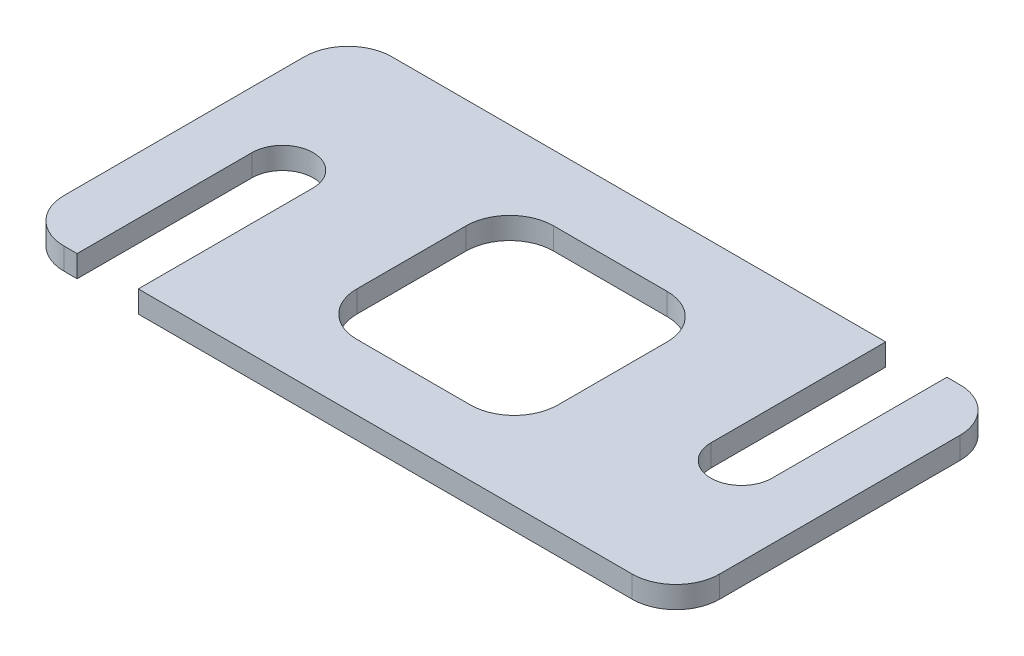
ISO-10303-21;
HEADER;
FILE_DESCRIPTION(('STEP AP214'),'2;1');
FILE_NAME('part.step','',(''),(''),'','','');
FILE_SCHEMA(('AUTOMOTIVE_DESIGN { 1 0 10303 214 1 1 1 1 }'));
ENDSEC;
DATA;
#1=APPLICATION_CONTEXT('core data for automotive mechanical design processes');
#2=APPLICATION_PROTOCOL_DEFINITION('international standard','automotive_design',2000,#1);
#3=PRODUCT_CONTEXT('',#1,'mechanical');
#4=PRODUCT('Part','Part','',(#3));
#5=PRODUCT_RELATED_PRODUCT_CATEGORY('part','',(#4));
#6=PRODUCT_DEFINITION_FORMATION('','',#4);
#7=PRODUCT_DEFINITION_CONTEXT('part definition',#1,'design');
#8=PRODUCT_DEFINITION('design','',#6,#7);
#9=PRODUCT_DEFINITION_SHAPE('','',#8);
#10=(LENGTH_UNIT() NAMED_UNIT(*) SI_UNIT(.MILLI.,.METRE.));
#11=(NAMED_UNIT(*) PLANE_ANGLE_UNIT() SI_UNIT($,.RADIAN.));
#12=(NAMED_UNIT(*) SI_UNIT($,.STERADIAN.) SOLID_ANGLE_UNIT());
#13=UNCERTAINTY_MEASURE_WITH_UNIT(LENGTH_MEASURE(1.E-05),#10,'distance_accuracy_value','');
#14=(GEOMETRIC_REPRESENTATION_CONTEXT(3) GLOBAL_UNCERTAINTY_ASSIGNED_CONTEXT((#13)) GLOBAL_UNIT_ASSIGNED_CONTEXT((#10,
#11,#12)) REPRESENTATION_CONTEXT('',''));
#15=CARTESIAN_POINT('',(0.,0.,0.));
#16=DIRECTION('',(0.,0.,1.));
#17=DIRECTION('',(1.,0.,0.));
#18=AXIS2_PLACEMENT_3D('',#15,#16,#17);
#19=CARTESIAN_POINT('',(150.,5.,0.));
#20=DIRECTION('',(0.,0.,-1.));
#21=DIRECTION('',(-1.,0.,0.));
#22=AXIS2_PLACEMENT_3D('',#19,#20,#21);
#23=PLANE('',#22);
#24=DIRECTION('',(1.,0.,0.));
#25=VECTOR('',#24,1.);
#26=CARTESIAN_POINT('',(150.,5.,0.));
#27=LINE('',#26,#25);
#28=CARTESIAN_POINT('',(10.,5.,0.));
#29=VERTEX_POINT('',#28);
#30=CARTESIAN_POINT('',(13.,5.,0.));
#31=VERTEX_POINT('',#30);
#32=EDGE_CURVE('E390',#29,#31,#27,.T.);
#33=ORIENTED_EDGE('',*,*,#32,.F.);
#34=DIRECTION('',(0.,-1.,0.));
#35=VECTOR('',#34,1.);
#36=CARTESIAN_POINT('',(10.,5.,0.));
#37=LINE('',#36,#35);
#38=CARTESIAN_POINT('',(10.,0.,0.));
#39=VERTEX_POINT('',#38);
#40=EDGE_CURVE('E281',#29,#39,#37,.T.);
#41=ORIENTED_EDGE('',*,*,#40,.T.);
#42=DIRECTION('',(1.,0.,0.));
#43=VECTOR('',#42,1.);
#44=CARTESIAN_POINT('',(150.,0.,0.));
#45=LINE('',#44,#43);
#46=CARTESIAN_POINT('',(13.,0.,0.));
#47=VERTEX_POINT('',#46);
#48=EDGE_CURVE('E229',#39,#47,#45,.T.);
#49=ORIENTED_EDGE('',*,*,#48,.T.);
#50=DIRECTION('',(0.,1.,0.));
#51=VECTOR('',#50,1.);
#52=CARTESIAN_POINT('',(13.,0.,0.));
#53=LINE('',#52,#51);
#54=EDGE_CURVE('E362',#47,#31,#53,.T.);
#55=ORIENTED_EDGE('',*,*,#54,.T.);
#56=EDGE_LOOP('',(#33,#41,#49,#55));
#57=FACE_BOUND('',#56,.T.);
#58=ADVANCED_FACE('F41',(#57),#23,.F.);
#59=CARTESIAN_POINT('',(0.,5.,-75.));
#60=DIRECTION('',(0.,0.,1.));
#61=DIRECTION('',(1.,0.,0.));
#62=AXIS2_PLACEMENT_3D('',#59,#60,#61);
#63=PLANE('',#62);
#64=DIRECTION('',(-1.,0.,0.));
#65=VECTOR('',#64,1.);
#66=CARTESIAN_POINT('',(0.,5.,-75.));
#67=LINE('',#66,#65);
#68=CARTESIAN_POINT('',(140.,5.,-75.));
#69=VERTEX_POINT('',#68);
#70=CARTESIAN_POINT('',(137.,5.,-75.));
#71=VERTEX_POINT('',#70);
#72=EDGE_CURVE('E395',#69,#71,#67,.T.);
#73=ORIENTED_EDGE('',*,*,#72,.F.);
#74=DIRECTION('',(0.,-1.,0.));
#75=VECTOR('',#74,1.);
#76=CARTESIAN_POINT('',(140.,5.,-75.));
#77=LINE('',#76,#75);
#78=CARTESIAN_POINT('',(140.,0.,-75.));
#79=VERTEX_POINT('',#78);
#80=EDGE_CURVE('E278',#69,#79,#77,.T.);
#81=ORIENTED_EDGE('',*,*,#80,.T.);
#82=DIRECTION('',(-1.,0.,0.));
#83=VECTOR('',#82,1.);
#84=CARTESIAN_POINT('',(0.,0.,-75.));
#85=LINE('',#84,#83);
#86=CARTESIAN_POINT('',(137.,0.,-75.));
#87=VERTEX_POINT('',#86);
#88=EDGE_CURVE('E243',#79,#87,#85,.T.);
#89=ORIENTED_EDGE('',*,*,#88,.T.);
#90=DIRECTION('',(0.,1.,0.));
#91=VECTOR('',#90,1.);
#92=CARTESIAN_POINT('',(137.,0.,-75.));
#93=LINE('',#92,#91);
#94=EDGE_CURVE('E352',#87,#71,#93,.T.);
#95=ORIENTED_EDGE('',*,*,#94,.T.);
#96=EDGE_LOOP('',(#73,#81,#89,#95));
#97=FACE_BOUND('',#96,.T.);
#98=ADVANCED_FACE('F445',(#97),#63,.F.);
#99=CARTESIAN_POINT('',(27.,0.,0.));
#100=VERTEX_POINT('',#99);
#101=CARTESIAN_POINT('',(140.,0.,0.));
#102=VERTEX_POINT('',#101);
#103=EDGE_CURVE('E220',#100,#102,#45,.T.);
#104=ORIENTED_EDGE('',*,*,#103,.T.);
#105=DIRECTION('',(0.,-1.,0.));
#106=VECTOR('',#105,1.);
#107=CARTESIAN_POINT('',(140.,5.,0.));
#108=LINE('',#107,#106);
#109=CARTESIAN_POINT('',(140.,5.,0.));
#110=VERTEX_POINT('',#109);
#111=EDGE_CURVE('E268',#102,#110,#108,.F.);
#112=ORIENTED_EDGE('',*,*,#111,.T.);
#113=CARTESIAN_POINT('',(27.,5.,0.));
#114=VERTEX_POINT('',#113);
#115=EDGE_CURVE('E223',#114,#110,#27,.T.);
#116=ORIENTED_EDGE('',*,*,#115,.F.);
#117=DIRECTION('',(0.,1.,0.));
#118=VECTOR('',#117,1.);
#119=CARTESIAN_POINT('',(27.,0.,0.));
#120=LINE('',#119,#118);
#121=EDGE_CURVE('E206',#100,#114,#120,.T.);
#122=ORIENTED_EDGE('',*,*,#121,.F.);
#123=EDGE_LOOP('',(#104,#112,#116,#122));
#124=FACE_BOUND('',#123,.T.);
#125=ADVANCED_FACE('F219',(#124),#23,.F.);
#126=CARTESIAN_POINT('',(150.,5.,-75.));
#127=DIRECTION('',(-1.,0.,0.));
#128=DIRECTION('',(0.,0.,1.));
#129=AXIS2_PLACEMENT_3D('',#126,#127,#128);
#130=PLANE('',#129);
#131=DIRECTION('',(0.,0.,-1.));
#132=VECTOR('',#131,1.);
#133=CARTESIAN_POINT('',(150.,5.,-75.));
#134=LINE('',#133,#132);
#135=CARTESIAN_POINT('',(150.,5.,-10.));
#136=VERTEX_POINT('',#135);
#137=CARTESIAN_POINT('',(150.,5.,-65.));
#138=VERTEX_POINT('',#137);
#139=EDGE_CURVE('E392',#136,#138,#134,.T.);
#140=ORIENTED_EDGE('',*,*,#139,.F.);
#141=DIRECTION('',(0.,-1.,0.));
#142=VECTOR('',#141,1.);
#143=CARTESIAN_POINT('',(150.,5.,-10.));
#144=LINE('',#143,#142);
#145=CARTESIAN_POINT('',(150.,0.,-10.));
#146=VERTEX_POINT('',#145);
#147=EDGE_CURVE('E258',#136,#146,#144,.T.);
#148=ORIENTED_EDGE('',*,*,#147,.T.);
#149=DIRECTION('',(0.,0.,-1.));
#150=VECTOR('',#149,1.);
#151=CARTESIAN_POINT('',(150.,0.,-75.));
#152=LINE('',#151,#150);
#153=CARTESIAN_POINT('',(150.,0.,-65.));
#154=VERTEX_POINT('',#153);
#155=EDGE_CURVE('E232',#146,#154,#152,.T.);
#156=ORIENTED_EDGE('',*,*,#155,.T.);
#157=DIRECTION('',(0.,-1.,0.));
#158=VECTOR('',#157,1.);
#159=CARTESIAN_POINT('',(150.,5.,-65.));
#160=LINE('',#159,#158);
#161=EDGE_CURVE('E256',#154,#138,#160,.F.);
#162=ORIENTED_EDGE('',*,*,#161,.T.);
#163=EDGE_LOOP('',(#140,#148,#156,#162));
#164=FACE_BOUND('',#163,.T.);
#165=ADVANCED_FACE('F437',(#164),#130,.F.);
#166=CARTESIAN_POINT('',(123.,0.,-75.));
#167=VERTEX_POINT('',#166);
#168=CARTESIAN_POINT('',(10.,0.,-75.));
#169=VERTEX_POINT('',#168);
#170=EDGE_CURVE('E242',#167,#169,#85,.T.);
#171=ORIENTED_EDGE('',*,*,#170,.T.);
#172=DIRECTION('',(0.,-1.,0.));
#173=VECTOR('',#172,1.);
#174=CARTESIAN_POINT('',(10.,5.,-75.));
#175=LINE('',#174,#173);
#176=CARTESIAN_POINT('',(10.,5.,-75.));
#177=VERTEX_POINT('',#176);
#178=EDGE_CURVE('E289',#169,#177,#175,.F.);
#179=ORIENTED_EDGE('',*,*,#178,.T.);
#180=CARTESIAN_POINT('',(123.,5.,-75.));
#181=VERTEX_POINT('',#180);
#182=EDGE_CURVE('E394',#181,#177,#67,.T.);
#183=ORIENTED_EDGE('',*,*,#182,.F.);
#184=DIRECTION('',(0.,1.,0.));
#185=VECTOR('',#184,1.);
#186=CARTESIAN_POINT('',(123.,0.,-75.));
#187=LINE('',#186,#185);
#188=EDGE_CURVE('E373',#167,#181,#187,.T.);
#189=ORIENTED_EDGE('',*,*,#188,.F.);
#190=EDGE_LOOP('',(#171,#179,#183,#189));
#191=FACE_BOUND('',#190,.T.);
#192=ADVANCED_FACE('F455',(#191),#63,.F.);
#193=CARTESIAN_POINT('',(0.,5.,0.));
#194=DIRECTION('',(1.,0.,0.));
#195=DIRECTION('',(0.,0.,-1.));
#196=AXIS2_PLACEMENT_3D('',#193,#194,#195);
#197=PLANE('',#196);
#198=DIRECTION('',(0.,0.,1.));
#199=VECTOR('',#198,1.);
#200=CARTESIAN_POINT('',(0.,0.,0.));
#201=LINE('',#200,#199);
#202=CARTESIAN_POINT('',(0.,0.,-65.));
#203=VERTEX_POINT('',#202);
#204=CARTESIAN_POINT('',(0.,0.,-10.));
#205=VERTEX_POINT('',#204);
#206=EDGE_CURVE('E245',#203,#205,#201,.T.);
#207=ORIENTED_EDGE('',*,*,#206,.T.);
#208=DIRECTION('',(0.,-1.,0.));
#209=VECTOR('',#208,1.);
#210=CARTESIAN_POINT('',(0.,5.,-10.));
#211=LINE('',#210,#209);
#212=CARTESIAN_POINT('',(0.,5.,-10.));
#213=VERTEX_POINT('',#212);
#214=EDGE_CURVE('E287',#205,#213,#211,.F.);
#215=ORIENTED_EDGE('',*,*,#214,.T.);
#216=DIRECTION('',(0.,0.,1.));
#217=VECTOR('',#216,1.);
#218=CARTESIAN_POINT('',(0.,5.,0.));
#219=LINE('',#218,#217);
#220=CARTESIAN_POINT('',(0.,5.,-65.));
#221=VERTEX_POINT('',#220);
#222=EDGE_CURVE('E238',#221,#213,#219,.T.);
#223=ORIENTED_EDGE('',*,*,#222,.F.);
#224=DIRECTION('',(0.,-1.,0.));
#225=VECTOR('',#224,1.);
#226=CARTESIAN_POINT('',(0.,5.,-65.));
#227=LINE('',#226,#225);
#228=EDGE_CURVE('E284',#221,#203,#227,.T.);
#229=ORIENTED_EDGE('',*,*,#228,.T.);
#230=EDGE_LOOP('',(#207,#215,#223,#229));
#231=FACE_BOUND('',#230,.T.);
#232=ADVANCED_FACE('F412',(#231),#197,.F.);
#233=CARTESIAN_POINT('',(0.,5.,0.));
#234=DIRECTION('',(0.,-1.,0.));
#235=DIRECTION('',(0.,0.,-1.));
#236=AXIS2_PLACEMENT_3D('',#233,#234,#235);
#237=PLANE('',#236);
#238=DIRECTION('',(1.,0.,0.));
#239=VECTOR('',#238,1.);
#240=CARTESIAN_POINT('',(98.,5.,-15.));
#241=LINE('',#240,#239);
#242=CARTESIAN_POINT('',(62.,5.,-15.));
#243=VERTEX_POINT('',#242);
#244=CARTESIAN_POINT('',(88.,5.,-15.));
#245=VERTEX_POINT('',#244);
#246=EDGE_CURVE('E354',#243,#245,#241,.T.);
#247=ORIENTED_EDGE('',*,*,#246,.F.);
#248=CARTESIAN_POINT('',(62.,5.,-25.));
#249=DIRECTION('',(0.,-1.,0.));
#250=DIRECTION('',(0.,0.,-1.));
#251=AXIS2_PLACEMENT_3D('',#248,#249,#250);
#252=CIRCLE('',#251,10.);
#253=CARTESIAN_POINT('',(52.,5.,-25.));
#254=VERTEX_POINT('',#253);
#255=EDGE_CURVE('E314',#243,#254,#252,.T.);
#256=ORIENTED_EDGE('',*,*,#255,.T.);
#257=DIRECTION('',(0.,0.,1.));
#258=VECTOR('',#257,1.);
#259=CARTESIAN_POINT('',(52.,5.,-15.));
#260=LINE('',#259,#258);
#261=CARTESIAN_POINT('',(52.,5.,-50.));
#262=VERTEX_POINT('',#261);
#263=EDGE_CURVE('E328',#262,#254,#260,.T.);
#264=ORIENTED_EDGE('',*,*,#263,.F.);
#265=CARTESIAN_POINT('',(62.,5.,-50.));
#266=DIRECTION('',(0.,-1.,0.));
#267=DIRECTION('',(0.,0.,-1.));
#268=AXIS2_PLACEMENT_3D('',#265,#266,#267);
#269=CIRCLE('',#268,10.);
#270=CARTESIAN_POINT('',(62.,5.,-60.));
#271=VERTEX_POINT('',#270);
#272=EDGE_CURVE('E49',#262,#271,#269,.T.);
#273=ORIENTED_EDGE('',*,*,#272,.T.);
#274=DIRECTION('',(-1.,0.,0.));
#275=VECTOR('',#274,1.);
#276=CARTESIAN_POINT('',(52.,5.,-60.));
#277=LINE('',#276,#275);
#278=CARTESIAN_POINT('',(88.,5.,-60.));
#279=VERTEX_POINT('',#278);
#280=EDGE_CURVE('E326',#279,#271,#277,.T.);
#281=ORIENTED_EDGE('',*,*,#280,.F.);
#282=CARTESIAN_POINT('',(88.,5.,-50.));
#283=DIRECTION('',(0.,-1.,0.));
#284=DIRECTION('',(0.,0.,-1.));
#285=AXIS2_PLACEMENT_3D('',#282,#283,#284);
#286=CIRCLE('',#285,10.);
#287=CARTESIAN_POINT('',(98.,5.,-50.));
#288=VERTEX_POINT('',#287);
#289=EDGE_CURVE('E318',#279,#288,#286,.T.);
#290=ORIENTED_EDGE('',*,*,#289,.T.);
#291=DIRECTION('',(0.,0.,-1.));
#292=VECTOR('',#291,1.);
#293=CARTESIAN_POINT('',(98.,5.,-60.));
#294=LINE('',#293,#292);
#295=CARTESIAN_POINT('',(98.,5.,-25.));
#296=VERTEX_POINT('',#295);
#297=EDGE_CURVE('E334',#296,#288,#294,.T.);
#298=ORIENTED_EDGE('',*,*,#297,.F.);
#299=CARTESIAN_POINT('',(88.,5.,-25.));
#300=DIRECTION('',(0.,-1.,0.));
#301=DIRECTION('',(0.,0.,-1.));
#302=AXIS2_PLACEMENT_3D('',#299,#300,#301);
#303=CIRCLE('',#302,10.);
#304=EDGE_CURVE('E310',#296,#245,#303,.T.);
#305=ORIENTED_EDGE('',*,*,#304,.T.);
#306=EDGE_LOOP('',(#247,#256,#264,#273,#281,#290,#298,#305));
#307=FACE_BOUND('',#306,.T.);
#308=ORIENTED_EDGE('',*,*,#115,.T.);
#309=CARTESIAN_POINT('',(140.,5.,-10.));
#310=DIRECTION('',(0.,-1.,0.));
#311=DIRECTION('',(0.,0.,-1.));
#312=AXIS2_PLACEMENT_3D('',#309,#310,#311);
#313=CIRCLE('',#312,10.);
#314=EDGE_CURVE('E276',#110,#136,#313,.F.);
#315=ORIENTED_EDGE('',*,*,#314,.T.);
#316=ORIENTED_EDGE('',*,*,#139,.T.);
#317=CARTESIAN_POINT('',(140.,5.,-65.));
#318=DIRECTION('',(0.,-1.,0.));
#319=DIRECTION('',(0.,0.,-1.));
#320=AXIS2_PLACEMENT_3D('',#317,#318,#319);
#321=CIRCLE('',#320,10.);
#322=EDGE_CURVE('E274',#138,#69,#321,.F.);
#323=ORIENTED_EDGE('',*,*,#322,.T.);
#324=ORIENTED_EDGE('',*,*,#72,.T.);
#325=DIRECTION('',(0.,0.,1.));
#326=VECTOR('',#325,1.);
#327=CARTESIAN_POINT('',(137.,5.,0.));
#328=LINE('',#327,#326);
#329=CARTESIAN_POINT('',(137.,5.,-35.));
#330=VERTEX_POINT('',#329);
#331=EDGE_CURVE('E251',#71,#330,#328,.T.);
#332=ORIENTED_EDGE('',*,*,#331,.T.);
#333=CARTESIAN_POINT('',(130.,5.,-35.));
#334=DIRECTION('',(0.,1.,0.));
#335=DIRECTION('',(0.,0.,1.));
#336=AXIS2_PLACEMENT_3D('',#333,#334,#335);
#337=CIRCLE('',#336,7.00000000000001);
#338=CARTESIAN_POINT('',(123.,5.,-35.));
#339=VERTEX_POINT('',#338);
#340=EDGE_CURVE('E248',#339,#330,#337,.T.);
#341=ORIENTED_EDGE('',*,*,#340,.F.);
#342=DIRECTION('',(0.,0.,-1.));
#343=VECTOR('',#342,1.);
#344=CARTESIAN_POINT('',(123.,5.,0.));
#345=LINE('',#344,#343);
#346=EDGE_CURVE('E252',#339,#181,#345,.T.);
#347=ORIENTED_EDGE('',*,*,#346,.T.);
#348=ORIENTED_EDGE('',*,*,#182,.T.);
#349=CARTESIAN_POINT('',(10.,5.,-65.));
#350=DIRECTION('',(0.,-1.,0.));
#351=DIRECTION('',(0.,0.,-1.));
#352=AXIS2_PLACEMENT_3D('',#349,#350,#351);
#353=CIRCLE('',#352,10.);
#354=EDGE_CURVE('E270',#177,#221,#353,.F.);
#355=ORIENTED_EDGE('',*,*,#354,.T.);
#356=ORIENTED_EDGE('',*,*,#222,.T.);
#357=CARTESIAN_POINT('',(10.,5.,-10.));
#358=DIRECTION('',(0.,-1.,0.));
#359=DIRECTION('',(0.,0.,-1.));
#360=AXIS2_PLACEMENT_3D('',#357,#358,#359);
#361=CIRCLE('',#360,10.);
#362=EDGE_CURVE('E272',#213,#29,#361,.F.);
#363=ORIENTED_EDGE('',*,*,#362,.T.);
#364=ORIENTED_EDGE('',*,*,#32,.T.);
#365=DIRECTION('',(0.,0.,-1.));
#366=VECTOR('',#365,1.);
#367=CARTESIAN_POINT('',(13.,5.,0.));
#368=LINE('',#367,#366);
#369=CARTESIAN_POINT('',(13.,5.,-40.));
#370=VERTEX_POINT('',#369);
#371=EDGE_CURVE('E230',#31,#370,#368,.T.);
#372=ORIENTED_EDGE('',*,*,#371,.T.);
#373=CARTESIAN_POINT('',(20.,5.,-40.));
#374=DIRECTION('',(0.,1.,0.));
#375=DIRECTION('',(0.,0.,1.));
#376=AXIS2_PLACEMENT_3D('',#373,#374,#375);
#377=CIRCLE('',#376,7.00000000000003);
#378=CARTESIAN_POINT('',(27.,5.,-40.));
#379=VERTEX_POINT('',#378);
#380=EDGE_CURVE('E234',#379,#370,#377,.T.);
#381=ORIENTED_EDGE('',*,*,#380,.F.);
#382=DIRECTION('',(0.,0.,1.));
#383=VECTOR('',#382,1.);
#384=CARTESIAN_POINT('',(27.,5.,0.));
#385=LINE('',#384,#383);
#386=EDGE_CURVE('E255',#379,#114,#385,.T.);
#387=ORIENTED_EDGE('',*,*,#386,.T.);
#388=EDGE_LOOP('',(#308,#315,#316,#323,#324,#332,#341,#347,#348,#355,#356,#363,#364,#372,#381,#387));
#389=FACE_BOUND('',#388,.T.);
#390=ADVANCED_FACE('F324',(#307,#389),#237,.F.);
#391=CARTESIAN_POINT('',(0.,0.,0.));
#392=DIRECTION('',(0.,-1.,0.));
#393=DIRECTION('',(0.,0.,-1.));
#394=AXIS2_PLACEMENT_3D('',#391,#392,#393);
#395=PLANE('',#394);
#396=DIRECTION('',(-1.,0.,0.));
#397=VECTOR('',#396,1.);
#398=CARTESIAN_POINT('',(52.,0.,-60.));
#399=LINE('',#398,#397);
#400=CARTESIAN_POINT('',(88.,0.,-60.));
#401=VERTEX_POINT('',#400);
#402=CARTESIAN_POINT('',(62.,0.,-60.));
#403=VERTEX_POINT('',#402);
#404=EDGE_CURVE('E340',#401,#403,#399,.T.);
#405=ORIENTED_EDGE('',*,*,#404,.T.);
#406=CARTESIAN_POINT('',(62.,0.,-50.));
#407=DIRECTION('',(0.,-1.,0.));
#408=DIRECTION('',(0.,0.,-1.));
#409=AXIS2_PLACEMENT_3D('',#406,#407,#408);
#410=CIRCLE('',#409,10.);
#411=CARTESIAN_POINT('',(52.,0.,-50.));
#412=VERTEX_POINT('',#411);
#413=EDGE_CURVE('E11',#403,#412,#410,.F.);
#414=ORIENTED_EDGE('',*,*,#413,.T.);
#415=DIRECTION('',(0.,0.,1.));
#416=VECTOR('',#415,1.);
#417=CARTESIAN_POINT('',(52.,0.,-15.));
#418=LINE('',#417,#416);
#419=CARTESIAN_POINT('',(52.,0.,-25.));
#420=VERTEX_POINT('',#419);
#421=EDGE_CURVE('E333',#412,#420,#418,.T.);
#422=ORIENTED_EDGE('',*,*,#421,.T.);
#423=CARTESIAN_POINT('',(62.,0.,-25.));
#424=DIRECTION('',(0.,-1.,0.));
#425=DIRECTION('',(0.,0.,-1.));
#426=AXIS2_PLACEMENT_3D('',#423,#424,#425);
#427=CIRCLE('',#426,10.);
#428=CARTESIAN_POINT('',(62.,0.,-15.));
#429=VERTEX_POINT('',#428);
#430=EDGE_CURVE('E316',#420,#429,#427,.F.);
#431=ORIENTED_EDGE('',*,*,#430,.T.);
#432=DIRECTION('',(1.,0.,0.));
#433=VECTOR('',#432,1.);
#434=CARTESIAN_POINT('',(98.,0.,-15.));
#435=LINE('',#434,#433);
#436=CARTESIAN_POINT('',(88.,0.,-15.));
#437=VERTEX_POINT('',#436);
#438=EDGE_CURVE('E344',#429,#437,#435,.T.);
#439=ORIENTED_EDGE('',*,*,#438,.T.);
#440=CARTESIAN_POINT('',(88.,0.,-25.));
#441=DIRECTION('',(0.,-1.,0.));
#442=DIRECTION('',(0.,0.,-1.));
#443=AXIS2_PLACEMENT_3D('',#440,#441,#442);
#444=CIRCLE('',#443,10.);
#445=CARTESIAN_POINT('',(98.,0.,-25.));
#446=VERTEX_POINT('',#445);
#447=EDGE_CURVE('E312',#437,#446,#444,.F.);
#448=ORIENTED_EDGE('',*,*,#447,.T.);
#449=DIRECTION('',(0.,0.,-1.));
#450=VECTOR('',#449,1.);
#451=CARTESIAN_POINT('',(98.,0.,-60.));
#452=LINE('',#451,#450);
#453=CARTESIAN_POINT('',(98.,0.,-50.));
#454=VERTEX_POINT('',#453);
#455=EDGE_CURVE('E347',#446,#454,#452,.T.);
#456=ORIENTED_EDGE('',*,*,#455,.T.);
#457=CARTESIAN_POINT('',(88.,0.,-50.));
#458=DIRECTION('',(0.,-1.,0.));
#459=DIRECTION('',(0.,0.,-1.));
#460=AXIS2_PLACEMENT_3D('',#457,#458,#459);
#461=CIRCLE('',#460,10.);
#462=EDGE_CURVE('E63',#454,#401,#461,.F.);
#463=ORIENTED_EDGE('',*,*,#462,.T.);
#464=EDGE_LOOP('',(#405,#414,#422,#431,#439,#448,#456,#463));
#465=FACE_BOUND('',#464,.T.);
#466=ORIENTED_EDGE('',*,*,#155,.F.);
#467=CARTESIAN_POINT('',(140.,0.,-10.));
#468=DIRECTION('',(0.,-1.,0.));
#469=DIRECTION('',(0.,0.,-1.));
#470=AXIS2_PLACEMENT_3D('',#467,#468,#469);
#471=CIRCLE('',#470,10.);
#472=EDGE_CURVE('E228',#146,#102,#471,.T.);
#473=ORIENTED_EDGE('',*,*,#472,.T.);
#474=ORIENTED_EDGE('',*,*,#103,.F.);
#475=DIRECTION('',(0.,0.,-1.));
#476=VECTOR('',#475,1.);
#477=CARTESIAN_POINT('',(27.,0.,-40.));
#478=LINE('',#477,#476);
#479=CARTESIAN_POINT('',(27.,0.,-40.));
#480=VERTEX_POINT('',#479);
#481=EDGE_CURVE('E203',#100,#480,#478,.T.);
#482=ORIENTED_EDGE('',*,*,#481,.T.);
#483=CARTESIAN_POINT('',(20.,0.,-40.));
#484=DIRECTION('',(0.,1.,0.));
#485=DIRECTION('',(0.,0.,-1.));
#486=AXIS2_PLACEMENT_3D('',#483,#484,#485);
#487=CIRCLE('',#486,7.00000000000003);
#488=CARTESIAN_POINT('',(13.,0.,-40.));
#489=VERTEX_POINT('',#488);
#490=EDGE_CURVE('E213',#480,#489,#487,.T.);
#491=ORIENTED_EDGE('',*,*,#490,.T.);
#492=DIRECTION('',(0.,0.,1.));
#493=VECTOR('',#492,1.);
#494=CARTESIAN_POINT('',(13.,0.,0.));
#495=LINE('',#494,#493);
#496=EDGE_CURVE('E224',#489,#47,#495,.T.);
#497=ORIENTED_EDGE('',*,*,#496,.T.);
#498=ORIENTED_EDGE('',*,*,#48,.F.);
#499=CARTESIAN_POINT('',(10.,0.,-10.));
#500=DIRECTION('',(0.,-1.,0.));
#501=DIRECTION('',(0.,0.,-1.));
#502=AXIS2_PLACEMENT_3D('',#499,#500,#501);
#503=CIRCLE('',#502,10.);
#504=EDGE_CURVE('E263',#39,#205,#503,.T.);
#505=ORIENTED_EDGE('',*,*,#504,.T.);
#506=ORIENTED_EDGE('',*,*,#206,.F.);
#507=CARTESIAN_POINT('',(10.,0.,-65.));
#508=DIRECTION('',(0.,-1.,0.));
#509=DIRECTION('',(0.,0.,-1.));
#510=AXIS2_PLACEMENT_3D('',#507,#508,#509);
#511=CIRCLE('',#510,10.);
#512=EDGE_CURVE('E261',#203,#169,#511,.T.);
#513=ORIENTED_EDGE('',*,*,#512,.T.);
#514=ORIENTED_EDGE('',*,*,#170,.F.);
#515=DIRECTION('',(0.,0.,1.));
#516=VECTOR('',#515,1.);
#517=CARTESIAN_POINT('',(123.,0.,-35.));
#518=LINE('',#517,#516);
#519=CARTESIAN_POINT('',(123.,0.,-35.));
#520=VERTEX_POINT('',#519);
#521=EDGE_CURVE('E214',#167,#520,#518,.T.);
#522=ORIENTED_EDGE('',*,*,#521,.T.);
#523=CARTESIAN_POINT('',(130.,0.,-35.));
#524=DIRECTION('',(0.,1.,0.));
#525=DIRECTION('',(0.,0.,-1.));
#526=AXIS2_PLACEMENT_3D('',#523,#524,#525);
#527=CIRCLE('',#526,7.00000000000001);
#528=CARTESIAN_POINT('',(137.,0.,-35.));
#529=VERTEX_POINT('',#528);
#530=EDGE_CURVE('E380',#520,#529,#527,.T.);
#531=ORIENTED_EDGE('',*,*,#530,.T.);
#532=DIRECTION('',(0.,0.,-1.));
#533=VECTOR('',#532,1.);
#534=CARTESIAN_POINT('',(137.,0.,-75.));
#535=LINE('',#534,#533);
#536=EDGE_CURVE('E375',#529,#87,#535,.T.);
#537=ORIENTED_EDGE('',*,*,#536,.T.);
#538=ORIENTED_EDGE('',*,*,#88,.F.);
#539=CARTESIAN_POINT('',(140.,0.,-65.));
#540=DIRECTION('',(0.,-1.,0.));
#541=DIRECTION('',(0.,0.,-1.));
#542=AXIS2_PLACEMENT_3D('',#539,#540,#541);
#543=CIRCLE('',#542,10.);
#544=EDGE_CURVE('E265',#79,#154,#543,.T.);
#545=ORIENTED_EDGE('',*,*,#544,.T.);
#546=EDGE_LOOP('',(#466,#473,#474,#482,#491,#497,#498,#505,#506,#513,#514,#522,#531,#537,#538,#545));
#547=FACE_BOUND('',#546,.T.);
#548=ADVANCED_FACE('F227',(#465,#547),#395,.T.);
#549=CARTESIAN_POINT('',(137.,0.,-75.));
#550=DIRECTION('',(1.,0.,0.));
#551=DIRECTION('',(0.,0.,-1.));
#552=AXIS2_PLACEMENT_3D('',#549,#550,#551);
#553=PLANE('',#552);
#554=ORIENTED_EDGE('',*,*,#94,.F.);
#555=ORIENTED_EDGE('',*,*,#536,.F.);
#556=DIRECTION('',(0.,1.,0.));
#557=VECTOR('',#556,1.);
#558=CARTESIAN_POINT('',(137.,0.,-35.));
#559=LINE('',#558,#557);
#560=EDGE_CURVE('E368',#529,#330,#559,.T.);
#561=ORIENTED_EDGE('',*,*,#560,.T.);
#562=ORIENTED_EDGE('',*,*,#331,.F.);
#563=EDGE_LOOP('',(#554,#555,#561,#562));
#564=FACE_BOUND('',#563,.T.);
#565=ADVANCED_FACE('F449',(#564),#553,.F.);
#566=CARTESIAN_POINT('',(130.,0.,-35.));
#567=DIRECTION('',(0.,1.,0.));
#568=DIRECTION('',(0.,0.,1.));
#569=AXIS2_PLACEMENT_3D('',#566,#567,#568);
#570=CYLINDRICAL_SURFACE('',#569,7.00000000000001);
#571=ORIENTED_EDGE('',*,*,#560,.F.);
#572=ORIENTED_EDGE('',*,*,#530,.F.);
#573=DIRECTION('',(0.,1.,0.));
#574=VECTOR('',#573,1.);
#575=CARTESIAN_POINT('',(123.,0.,-35.));
#576=LINE('',#575,#574);
#577=EDGE_CURVE('E370',#520,#339,#576,.T.);
#578=ORIENTED_EDGE('',*,*,#577,.T.);
#579=ORIENTED_EDGE('',*,*,#340,.T.);
#580=EDGE_LOOP('',(#571,#572,#578,#579));
#581=FACE_BOUND('',#580,.T.);
#582=ADVANCED_FACE('F452',(#581),#570,.F.);
#583=CARTESIAN_POINT('',(123.,0.,-35.));
#584=DIRECTION('',(-1.,0.,0.));
#585=DIRECTION('',(0.,0.,1.));
#586=AXIS2_PLACEMENT_3D('',#583,#584,#585);
#587=PLANE('',#586);
#588=ORIENTED_EDGE('',*,*,#577,.F.);
#589=ORIENTED_EDGE('',*,*,#521,.F.);
#590=ORIENTED_EDGE('',*,*,#188,.T.);
#591=ORIENTED_EDGE('',*,*,#346,.F.);
#592=EDGE_LOOP('',(#588,#589,#590,#591));
#593=FACE_BOUND('',#592,.T.);
#594=ADVANCED_FACE('F454',(#593),#587,.F.);
#595=CARTESIAN_POINT('',(13.,0.,0.));
#596=DIRECTION('',(-1.,0.,0.));
#597=DIRECTION('',(0.,0.,1.));
#598=AXIS2_PLACEMENT_3D('',#595,#596,#597);
#599=PLANE('',#598);
#600=ORIENTED_EDGE('',*,*,#54,.F.);
#601=ORIENTED_EDGE('',*,*,#496,.F.);
#602=DIRECTION('',(0.,1.,0.));
#603=VECTOR('',#602,1.);
#604=CARTESIAN_POINT('',(13.,0.,-40.));
#605=LINE('',#604,#603);
#606=EDGE_CURVE('E364',#489,#370,#605,.T.);
#607=ORIENTED_EDGE('',*,*,#606,.T.);
#608=ORIENTED_EDGE('',*,*,#371,.F.);
#609=EDGE_LOOP('',(#600,#601,#607,#608));
#610=FACE_BOUND('',#609,.T.);
#611=ADVANCED_FACE('F427',(#610),#599,.F.);
#612=CARTESIAN_POINT('',(20.,0.,-40.));
#613=DIRECTION('',(0.,1.,0.));
#614=DIRECTION('',(0.,0.,1.));
#615=AXIS2_PLACEMENT_3D('',#612,#613,#614);
#616=CYLINDRICAL_SURFACE('',#615,7.00000000000003);
#617=ORIENTED_EDGE('',*,*,#606,.F.);
#618=ORIENTED_EDGE('',*,*,#490,.F.);
#619=DIRECTION('',(0.,1.,0.));
#620=VECTOR('',#619,1.);
#621=CARTESIAN_POINT('',(27.,0.,-40.));
#622=LINE('',#621,#620);
#623=EDGE_CURVE('E209',#480,#379,#622,.T.);
#624=ORIENTED_EDGE('',*,*,#623,.T.);
#625=ORIENTED_EDGE('',*,*,#380,.T.);
#626=EDGE_LOOP('',(#617,#618,#624,#625));
#627=FACE_BOUND('',#626,.T.);
#628=ADVANCED_FACE('F430',(#627),#616,.F.);
#629=CARTESIAN_POINT('',(27.,0.,-40.));
#630=DIRECTION('',(1.,0.,0.));
#631=DIRECTION('',(0.,0.,-1.));
#632=AXIS2_PLACEMENT_3D('',#629,#630,#631);
#633=PLANE('',#632);
#634=ORIENTED_EDGE('',*,*,#623,.F.);
#635=ORIENTED_EDGE('',*,*,#481,.F.);
#636=ORIENTED_EDGE('',*,*,#121,.T.);
#637=ORIENTED_EDGE('',*,*,#386,.F.);
#638=EDGE_LOOP('',(#634,#635,#636,#637));
#639=FACE_BOUND('',#638,.T.);
#640=ADVANCED_FACE('F205',(#639),#633,.F.);
#641=CARTESIAN_POINT('',(52.,0.,-15.));
#642=DIRECTION('',(-1.,0.,0.));
#643=DIRECTION('',(0.,0.,1.));
#644=AXIS2_PLACEMENT_3D('',#641,#642,#643);
#645=PLANE('',#644);
#646=ORIENTED_EDGE('',*,*,#263,.T.);
#647=DIRECTION('',(0.,1.,0.));
#648=VECTOR('',#647,1.);
#649=CARTESIAN_POINT('',(52.,0.,-25.));
#650=LINE('',#649,#648);
#651=EDGE_CURVE('E304',#254,#420,#650,.F.);
#652=ORIENTED_EDGE('',*,*,#651,.T.);
#653=ORIENTED_EDGE('',*,*,#421,.F.);
#654=DIRECTION('',(0.,1.,0.));
#655=VECTOR('',#654,1.);
#656=CARTESIAN_POINT('',(52.,5.,-50.));
#657=LINE('',#656,#655);
#658=EDGE_CURVE('E301',#412,#262,#657,.T.);
#659=ORIENTED_EDGE('',*,*,#658,.T.);
#660=EDGE_LOOP('',(#646,#652,#653,#659));
#661=FACE_BOUND('',#660,.T.);
#662=ADVANCED_FACE('F342',(#661),#645,.F.);
#663=CARTESIAN_POINT('',(52.,0.,-60.));
#664=DIRECTION('',(0.,0.,-1.));
#665=DIRECTION('',(-1.,0.,0.));
#666=AXIS2_PLACEMENT_3D('',#663,#664,#665);
#667=PLANE('',#666);
#668=ORIENTED_EDGE('',*,*,#404,.F.);
#669=DIRECTION('',(0.,1.,0.));
#670=VECTOR('',#669,1.);
#671=CARTESIAN_POINT('',(88.,5.,-60.));
#672=LINE('',#671,#670);
#673=EDGE_CURVE('E307',#401,#279,#672,.T.);
#674=ORIENTED_EDGE('',*,*,#673,.T.);
#675=ORIENTED_EDGE('',*,*,#280,.T.);
#676=DIRECTION('',(0.,1.,0.));
#677=VECTOR('',#676,1.);
#678=CARTESIAN_POINT('',(62.,0.,-60.));
#679=LINE('',#678,#677);
#680=EDGE_CURVE('E56',#271,#403,#679,.F.);
#681=ORIENTED_EDGE('',*,*,#680,.T.);
#682=EDGE_LOOP('',(#668,#674,#675,#681));
#683=FACE_BOUND('',#682,.T.);
#684=ADVANCED_FACE('F331',(#683),#667,.F.);
#685=CARTESIAN_POINT('',(98.,0.,-60.));
#686=DIRECTION('',(1.,0.,0.));
#687=DIRECTION('',(0.,0.,-1.));
#688=AXIS2_PLACEMENT_3D('',#685,#686,#687);
#689=PLANE('',#688);
#690=ORIENTED_EDGE('',*,*,#455,.F.);
#691=DIRECTION('',(0.,1.,0.));
#692=VECTOR('',#691,1.);
#693=CARTESIAN_POINT('',(98.,5.,-25.));
#694=LINE('',#693,#692);
#695=EDGE_CURVE('E293',#446,#296,#694,.T.);
#696=ORIENTED_EDGE('',*,*,#695,.T.);
#697=ORIENTED_EDGE('',*,*,#297,.T.);
#698=DIRECTION('',(0.,1.,0.));
#699=VECTOR('',#698,1.);
#700=CARTESIAN_POINT('',(98.,0.,-50.));
#701=LINE('',#700,#699);
#702=EDGE_CURVE('E291',#288,#454,#701,.F.);
#703=ORIENTED_EDGE('',*,*,#702,.T.);
#704=EDGE_LOOP('',(#690,#696,#697,#703));
#705=FACE_BOUND('',#704,.T.);
#706=ADVANCED_FACE('F582',(#705),#689,.F.);
#707=CARTESIAN_POINT('',(98.,0.,-15.));
#708=DIRECTION('',(0.,0.,1.));
#709=DIRECTION('',(1.,0.,0.));
#710=AXIS2_PLACEMENT_3D('',#707,#708,#709);
#711=PLANE('',#710);
#712=ORIENTED_EDGE('',*,*,#246,.T.);
#713=DIRECTION('',(0.,1.,0.));
#714=VECTOR('',#713,1.);
#715=CARTESIAN_POINT('',(88.,0.,-15.));
#716=LINE('',#715,#714);
#717=EDGE_CURVE('E299',#245,#437,#716,.F.);
#718=ORIENTED_EDGE('',*,*,#717,.T.);
#719=ORIENTED_EDGE('',*,*,#438,.F.);
#720=DIRECTION('',(0.,1.,0.));
#721=VECTOR('',#720,1.);
#722=CARTESIAN_POINT('',(62.,5.,-15.));
#723=LINE('',#722,#721);
#724=EDGE_CURVE('E296',#429,#243,#723,.T.);
#725=ORIENTED_EDGE('',*,*,#724,.T.);
#726=EDGE_LOOP('',(#712,#718,#719,#725));
#727=FACE_BOUND('',#726,.T.);
#728=ADVANCED_FACE('F591',(#727),#711,.F.);
#729=CARTESIAN_POINT('',(140.,5.,-10.));
#730=DIRECTION('',(0.,-1.,0.));
#731=DIRECTION('',(0.,0.,-1.));
#732=AXIS2_PLACEMENT_3D('',#729,#730,#731);
#733=CYLINDRICAL_SURFACE('',#732,10.);
#734=ORIENTED_EDGE('',*,*,#314,.F.);
#735=ORIENTED_EDGE('',*,*,#111,.F.);
#736=ORIENTED_EDGE('',*,*,#472,.F.);
#737=ORIENTED_EDGE('',*,*,#147,.F.);
#738=EDGE_LOOP('',(#734,#735,#736,#737));
#739=FACE_BOUND('',#738,.T.);
#740=ADVANCED_FACE('F435',(#739),#733,.T.);
#741=CARTESIAN_POINT('',(140.,5.,-65.));
#742=DIRECTION('',(0.,-1.,0.));
#743=DIRECTION('',(0.,0.,-1.));
#744=AXIS2_PLACEMENT_3D('',#741,#742,#743);
#745=CYLINDRICAL_SURFACE('',#744,10.);
#746=ORIENTED_EDGE('',*,*,#322,.F.);
#747=ORIENTED_EDGE('',*,*,#161,.F.);
#748=ORIENTED_EDGE('',*,*,#544,.F.);
#749=ORIENTED_EDGE('',*,*,#80,.F.);
#750=EDGE_LOOP('',(#746,#747,#748,#749));
#751=FACE_BOUND('',#750,.T.);
#752=ADVANCED_FACE('F443',(#751),#745,.T.);
#753=CARTESIAN_POINT('',(10.,5.,-10.));
#754=DIRECTION('',(0.,-1.,0.));
#755=DIRECTION('',(0.,0.,-1.));
#756=AXIS2_PLACEMENT_3D('',#753,#754,#755);
#757=CYLINDRICAL_SURFACE('',#756,10.);
#758=ORIENTED_EDGE('',*,*,#362,.F.);
#759=ORIENTED_EDGE('',*,*,#214,.F.);
#760=ORIENTED_EDGE('',*,*,#504,.F.);
#761=ORIENTED_EDGE('',*,*,#40,.F.);
#762=EDGE_LOOP('',(#758,#759,#760,#761));
#763=FACE_BOUND('',#762,.T.);
#764=ADVANCED_FACE('F420',(#763),#757,.T.);
#765=CARTESIAN_POINT('',(10.,5.,-65.));
#766=DIRECTION('',(0.,-1.,0.));
#767=DIRECTION('',(0.,0.,-1.));
#768=AXIS2_PLACEMENT_3D('',#765,#766,#767);
#769=CYLINDRICAL_SURFACE('',#768,10.);
#770=ORIENTED_EDGE('',*,*,#354,.F.);
#771=ORIENTED_EDGE('',*,*,#178,.F.);
#772=ORIENTED_EDGE('',*,*,#512,.F.);
#773=ORIENTED_EDGE('',*,*,#228,.F.);
#774=EDGE_LOOP('',(#770,#771,#772,#773));
#775=FACE_BOUND('',#774,.T.);
#776=ADVANCED_FACE('F409',(#775),#769,.T.);
#777=CARTESIAN_POINT('',(88.,0.,-25.));
#778=DIRECTION('',(0.,-1.,0.));
#779=DIRECTION('',(0.,0.,-1.));
#780=AXIS2_PLACEMENT_3D('',#777,#778,#779);
#781=CYLINDRICAL_SURFACE('',#780,10.);
#782=ORIENTED_EDGE('',*,*,#447,.F.);
#783=ORIENTED_EDGE('',*,*,#717,.F.);
#784=ORIENTED_EDGE('',*,*,#304,.F.);
#785=ORIENTED_EDGE('',*,*,#695,.F.);
#786=EDGE_LOOP('',(#782,#783,#784,#785));
#787=FACE_BOUND('',#786,.T.);
#788=ADVANCED_FACE('F632',(#787),#781,.F.);
#789=CARTESIAN_POINT('',(62.,0.,-25.));
#790=DIRECTION('',(0.,-1.,0.));
#791=DIRECTION('',(0.,0.,-1.));
#792=AXIS2_PLACEMENT_3D('',#789,#790,#791);
#793=CYLINDRICAL_SURFACE('',#792,10.);
#794=ORIENTED_EDGE('',*,*,#430,.F.);
#795=ORIENTED_EDGE('',*,*,#651,.F.);
#796=ORIENTED_EDGE('',*,*,#255,.F.);
#797=ORIENTED_EDGE('',*,*,#724,.F.);
#798=EDGE_LOOP('',(#794,#795,#796,#797));
#799=FACE_BOUND('',#798,.T.);
#800=ADVANCED_FACE('F640',(#799),#793,.F.);
#801=CARTESIAN_POINT('',(88.,0.,-50.));
#802=DIRECTION('',(0.,-1.,0.));
#803=DIRECTION('',(0.,0.,-1.));
#804=AXIS2_PLACEMENT_3D('',#801,#802,#803);
#805=CYLINDRICAL_SURFACE('',#804,10.);
#806=ORIENTED_EDGE('',*,*,#462,.F.);
#807=ORIENTED_EDGE('',*,*,#702,.F.);
#808=ORIENTED_EDGE('',*,*,#289,.F.);
#809=ORIENTED_EDGE('',*,*,#673,.F.);
#810=EDGE_LOOP('',(#806,#807,#808,#809));
#811=FACE_BOUND('',#810,.T.);
#812=ADVANCED_FACE('F650',(#811),#805,.F.);
#813=CARTESIAN_POINT('',(62.,0.,-50.));
#814=DIRECTION('',(0.,-1.,0.));
#815=DIRECTION('',(0.,0.,-1.));
#816=AXIS2_PLACEMENT_3D('',#813,#814,#815);
#817=CYLINDRICAL_SURFACE('',#816,10.);
#818=ORIENTED_EDGE('',*,*,#413,.F.);
#819=ORIENTED_EDGE('',*,*,#680,.F.);
#820=ORIENTED_EDGE('',*,*,#272,.F.);
#821=ORIENTED_EDGE('',*,*,#658,.F.);
#822=EDGE_LOOP('',(#818,#819,#820,#821));
#823=FACE_BOUND('',#822,.T.);
#824=ADVANCED_FACE('F43',(#823),#817,.F.);
#825=CLOSED_SHELL('',(#58,#98,#125,#165,#192,#232,#390,#548,#565,#582,#594,#611,#628,#640,#662,
#684,#706,#728,#740,#752,#764,#776,#788,#800,#812,#824));
#826=MANIFOLD_SOLID_BREP('B2',#825);
#827=ADVANCED_BREP_SHAPE_REPRESENTATION('',(#18,#826),#14);
#828=SHAPE_DEFINITION_REPRESENTATION(#9,#827);
ENDSEC;
END-ISO-10303-21;
